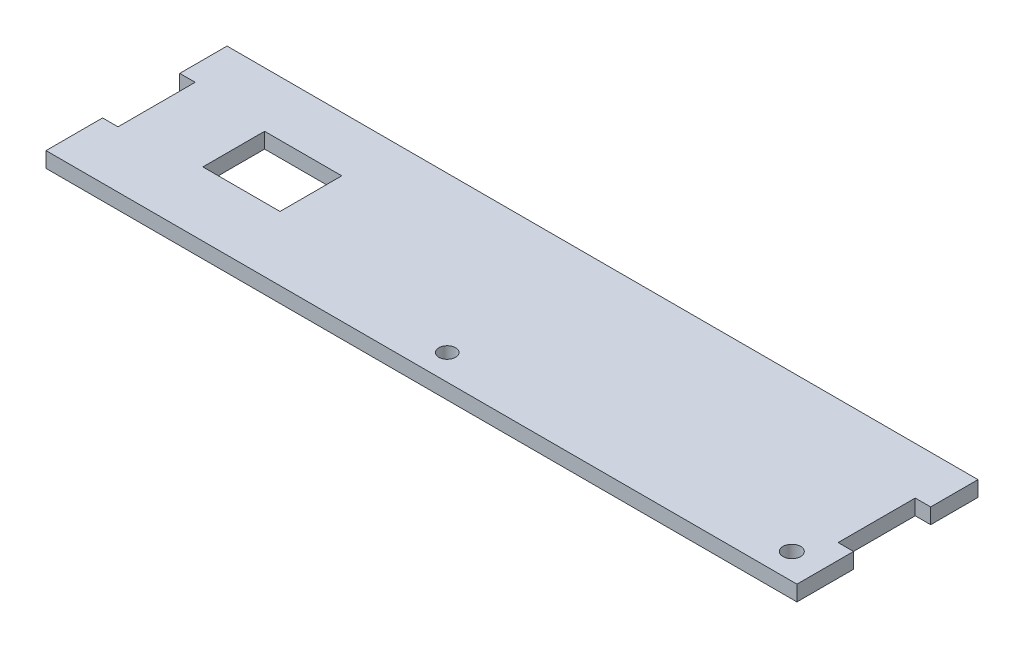
ISO-10303-21;
HEADER;
FILE_DESCRIPTION(('STEP AP214'),'2;1');
FILE_NAME('part.step','',(''),(''),'','','');
FILE_SCHEMA(('AUTOMOTIVE_DESIGN { 1 0 10303 214 1 1 1 1 }'));
ENDSEC;
DATA;
#1=APPLICATION_CONTEXT('core data for automotive mechanical design processes');
#2=APPLICATION_PROTOCOL_DEFINITION('international standard','automotive_design',2000,#1);
#3=PRODUCT_CONTEXT('',#1,'mechanical');
#4=PRODUCT('Part','Part','',(#3));
#5=PRODUCT_RELATED_PRODUCT_CATEGORY('part','',(#4));
#6=PRODUCT_DEFINITION_FORMATION('','',#4);
#7=PRODUCT_DEFINITION_CONTEXT('part definition',#1,'design');
#8=PRODUCT_DEFINITION('design','',#6,#7);
#9=PRODUCT_DEFINITION_SHAPE('','',#8);
#10=(LENGTH_UNIT() NAMED_UNIT(*) SI_UNIT(.MILLI.,.METRE.));
#11=(NAMED_UNIT(*) PLANE_ANGLE_UNIT() SI_UNIT($,.RADIAN.));
#12=(NAMED_UNIT(*) SI_UNIT($,.STERADIAN.) SOLID_ANGLE_UNIT());
#13=UNCERTAINTY_MEASURE_WITH_UNIT(LENGTH_MEASURE(1.E-05),#10,'distance_accuracy_value','');
#14=(GEOMETRIC_REPRESENTATION_CONTEXT(3) GLOBAL_UNCERTAINTY_ASSIGNED_CONTEXT((#13)) GLOBAL_UNIT_ASSIGNED_CONTEXT((#10,
#11,#12)) REPRESENTATION_CONTEXT('',''));
#15=CARTESIAN_POINT('',(0.,0.,0.));
#16=DIRECTION('',(0.,0.,1.));
#17=DIRECTION('',(1.,0.,0.));
#18=AXIS2_PLACEMENT_3D('',#15,#16,#17);
#19=CARTESIAN_POINT('',(-73.,3.,30.5));
#20=DIRECTION('',(1.,0.,0.));
#21=DIRECTION('',(0.,0.,-1.));
#22=AXIS2_PLACEMENT_3D('',#19,#20,#21);
#23=PLANE('',#22);
#24=DIRECTION('',(0.,0.,1.));
#25=VECTOR('',#24,1.);
#26=CARTESIAN_POINT('',(-73.,3.,30.5));
#27=LINE('',#26,#25);
#28=CARTESIAN_POINT('',(-73.,3.,-4.69999999999999));
#29=VERTEX_POINT('',#28);
#30=CARTESIAN_POINT('',(-73.,3.,4.50000000000001));
#31=VERTEX_POINT('',#30);
#32=EDGE_CURVE('E173',#29,#31,#27,.T.);
#33=ORIENTED_EDGE('',*,*,#32,.F.);
#34=DIRECTION('',(0.,1.,0.));
#35=VECTOR('',#34,1.);
#36=CARTESIAN_POINT('',(-73.,-7.,-4.69999999999999));
#37=LINE('',#36,#35);
#38=CARTESIAN_POINT('',(-73.,0.,-4.69999999999999));
#39=VERTEX_POINT('',#38);
#40=EDGE_CURVE('E159',#39,#29,#37,.T.);
#41=ORIENTED_EDGE('',*,*,#40,.F.);
#42=DIRECTION('',(0.,0.,1.));
#43=VECTOR('',#42,1.);
#44=CARTESIAN_POINT('',(-73.,0.,30.5));
#45=LINE('',#44,#43);
#46=CARTESIAN_POINT('',(-73.,0.,4.50000000000001));
#47=VERTEX_POINT('',#46);
#48=EDGE_CURVE('E200',#39,#47,#45,.T.);
#49=ORIENTED_EDGE('',*,*,#48,.T.);
#50=DIRECTION('',(0.,1.,0.));
#51=VECTOR('',#50,1.);
#52=CARTESIAN_POINT('',(-73.,-7.,4.50000000000001));
#53=LINE('',#52,#51);
#54=EDGE_CURVE('E182',#47,#31,#53,.T.);
#55=ORIENTED_EDGE('',*,*,#54,.T.);
#56=EDGE_LOOP('',(#33,#41,#49,#55));
#57=FACE_BOUND('',#56,.T.);
#58=ADVANCED_FACE('F47',(#57),#23,.F.);
#59=CARTESIAN_POINT('',(73.,3.,30.5));
#60=DIRECTION('',(-1.,0.,0.));
#61=DIRECTION('',(0.,0.,1.));
#62=AXIS2_PLACEMENT_3D('',#59,#60,#61);
#63=PLANE('',#62);
#64=DIRECTION('',(0.,0.,-1.));
#65=VECTOR('',#64,1.);
#66=CARTESIAN_POINT('',(73.,0.,30.5));
#67=LINE('',#66,#65);
#68=CARTESIAN_POINT('',(73.,0.,4.49999999999999));
#69=VERTEX_POINT('',#68);
#70=CARTESIAN_POINT('',(73.,0.,-4.69999999999998));
#71=VERTEX_POINT('',#70);
#72=EDGE_CURVE('E207',#69,#71,#67,.T.);
#73=ORIENTED_EDGE('',*,*,#72,.T.);
#74=DIRECTION('',(0.,1.,0.));
#75=VECTOR('',#74,1.);
#76=CARTESIAN_POINT('',(73.,-7.,-4.69999999999999));
#77=LINE('',#76,#75);
#78=CARTESIAN_POINT('',(73.,3.,-4.69999999999999));
#79=VERTEX_POINT('',#78);
#80=EDGE_CURVE('E63',#71,#79,#77,.T.);
#81=ORIENTED_EDGE('',*,*,#80,.T.);
#82=DIRECTION('',(0.,0.,-1.));
#83=VECTOR('',#82,1.);
#84=CARTESIAN_POINT('',(73.,3.,30.5));
#85=LINE('',#84,#83);
#86=CARTESIAN_POINT('',(73.,3.,4.49999999999999));
#87=VERTEX_POINT('',#86);
#88=EDGE_CURVE('E177',#87,#79,#85,.T.);
#89=ORIENTED_EDGE('',*,*,#88,.F.);
#90=DIRECTION('',(0.,1.,0.));
#91=VECTOR('',#90,1.);
#92=CARTESIAN_POINT('',(73.,-7.,4.49999999999999));
#93=LINE('',#92,#91);
#94=EDGE_CURVE('E329',#69,#87,#93,.T.);
#95=ORIENTED_EDGE('',*,*,#94,.F.);
#96=EDGE_LOOP('',(#73,#81,#89,#95));
#97=FACE_BOUND('',#96,.T.);
#98=ADVANCED_FACE('F372',(#97),#63,.F.);
#99=CARTESIAN_POINT('',(-73.,3.,19.5));
#100=VERTEX_POINT('',#99);
#101=CARTESIAN_POINT('',(-73.,3.,30.5));
#102=VERTEX_POINT('',#101);
#103=EDGE_CURVE('E185',#100,#102,#27,.T.);
#104=ORIENTED_EDGE('',*,*,#103,.F.);
#105=DIRECTION('',(0.,1.,0.));
#106=VECTOR('',#105,1.);
#107=CARTESIAN_POINT('',(-73.,-7.,19.5));
#108=LINE('',#107,#106);
#109=CARTESIAN_POINT('',(-73.,0.,19.5));
#110=VERTEX_POINT('',#109);
#111=EDGE_CURVE('E303',#110,#100,#108,.T.);
#112=ORIENTED_EDGE('',*,*,#111,.F.);
#113=CARTESIAN_POINT('',(-73.,0.,30.5));
#114=VERTEX_POINT('',#113);
#115=EDGE_CURVE('E204',#110,#114,#45,.T.);
#116=ORIENTED_EDGE('',*,*,#115,.T.);
#117=DIRECTION('',(0.,-1.,0.));
#118=VECTOR('',#117,1.);
#119=CARTESIAN_POINT('',(-73.,3.,30.5));
#120=LINE('',#119,#118);
#121=EDGE_CURVE('E214',#102,#114,#120,.T.);
#122=ORIENTED_EDGE('',*,*,#121,.F.);
#123=EDGE_LOOP('',(#104,#112,#116,#122));
#124=FACE_BOUND('',#123,.T.);
#125=ADVANCED_FACE('F49',(#124),#23,.F.);
#126=CARTESIAN_POINT('',(73.,3.,30.5));
#127=DIRECTION('',(0.,0.,-1.));
#128=DIRECTION('',(-1.,0.,0.));
#129=AXIS2_PLACEMENT_3D('',#126,#127,#128);
#130=PLANE('',#129);
#131=DIRECTION('',(1.,0.,0.));
#132=VECTOR('',#131,1.);
#133=CARTESIAN_POINT('',(73.,0.,30.5));
#134=LINE('',#133,#132);
#135=CARTESIAN_POINT('',(73.,0.,30.5));
#136=VERTEX_POINT('',#135);
#137=EDGE_CURVE('E203',#114,#136,#134,.T.);
#138=ORIENTED_EDGE('',*,*,#137,.T.);
#139=DIRECTION('',(0.,-1.,0.));
#140=VECTOR('',#139,1.);
#141=CARTESIAN_POINT('',(73.,3.,30.5));
#142=LINE('',#141,#140);
#143=CARTESIAN_POINT('',(73.,3.,30.5));
#144=VERTEX_POINT('',#143);
#145=EDGE_CURVE('E199',#144,#136,#142,.T.);
#146=ORIENTED_EDGE('',*,*,#145,.F.);
#147=DIRECTION('',(1.,0.,0.));
#148=VECTOR('',#147,1.);
#149=CARTESIAN_POINT('',(73.,3.,30.5));
#150=LINE('',#149,#148);
#151=EDGE_CURVE('E184',#102,#144,#150,.T.);
#152=ORIENTED_EDGE('',*,*,#151,.F.);
#153=ORIENTED_EDGE('',*,*,#121,.T.);
#154=EDGE_LOOP('',(#138,#146,#152,#153));
#155=FACE_BOUND('',#154,.T.);
#156=ADVANCED_FACE('F380',(#155),#130,.F.);
#157=CARTESIAN_POINT('',(73.,0.,19.5));
#158=VERTEX_POINT('',#157);
#159=EDGE_CURVE('E190',#136,#158,#67,.T.);
#160=ORIENTED_EDGE('',*,*,#159,.T.);
#161=DIRECTION('',(0.,1.,0.));
#162=VECTOR('',#161,1.);
#163=CARTESIAN_POINT('',(73.,-7.,19.5));
#164=LINE('',#163,#162);
#165=CARTESIAN_POINT('',(73.,3.,19.5));
#166=VERTEX_POINT('',#165);
#167=EDGE_CURVE('E325',#158,#166,#164,.T.);
#168=ORIENTED_EDGE('',*,*,#167,.T.);
#169=EDGE_CURVE('E195',#144,#166,#85,.T.);
#170=ORIENTED_EDGE('',*,*,#169,.F.);
#171=ORIENTED_EDGE('',*,*,#145,.T.);
#172=EDGE_LOOP('',(#160,#168,#170,#171));
#173=FACE_BOUND('',#172,.T.);
#174=ADVANCED_FACE('F351',(#173),#63,.F.);
#175=CARTESIAN_POINT('',(0.,3.,0.));
#176=DIRECTION('',(0.,1.,0.));
#177=DIRECTION('',(0.,0.,1.));
#178=AXIS2_PLACEMENT_3D('',#175,#176,#177);
#179=PLANE('',#178);
#180=DIRECTION('',(1.,0.,0.));
#181=VECTOR('',#180,1.);
#182=CARTESIAN_POINT('',(-73.,3.,-4.69999999999999));
#183=LINE('',#182,#181);
#184=EDGE_CURVE('E162',#29,#79,#183,.T.);
#185=ORIENTED_EDGE('',*,*,#184,.F.);
#186=ORIENTED_EDGE('',*,*,#32,.T.);
#187=DIRECTION('',(-1.,0.,0.));
#188=VECTOR('',#187,1.);
#189=CARTESIAN_POINT('',(-73.,3.,4.50000000000001));
#190=LINE('',#189,#188);
#191=CARTESIAN_POINT('',(-70.,3.,4.50000000000001));
#192=VERTEX_POINT('',#191);
#193=EDGE_CURVE('E278',#192,#31,#190,.T.);
#194=ORIENTED_EDGE('',*,*,#193,.F.);
#195=DIRECTION('',(0.,0.,-1.));
#196=VECTOR('',#195,1.);
#197=CARTESIAN_POINT('',(-70.,3.,4.50000000000001));
#198=LINE('',#197,#196);
#199=CARTESIAN_POINT('',(-70.,3.,19.5));
#200=VERTEX_POINT('',#199);
#201=EDGE_CURVE('E302',#200,#192,#198,.T.);
#202=ORIENTED_EDGE('',*,*,#201,.F.);
#203=DIRECTION('',(1.,0.,0.));
#204=VECTOR('',#203,1.);
#205=CARTESIAN_POINT('',(-70.,3.,19.5));
#206=LINE('',#205,#204);
#207=EDGE_CURVE('E284',#100,#200,#206,.T.);
#208=ORIENTED_EDGE('',*,*,#207,.F.);
#209=ORIENTED_EDGE('',*,*,#103,.T.);
#210=ORIENTED_EDGE('',*,*,#151,.T.);
#211=ORIENTED_EDGE('',*,*,#169,.T.);
#212=DIRECTION('',(1.,0.,0.));
#213=VECTOR('',#212,1.);
#214=CARTESIAN_POINT('',(70.,3.,19.5));
#215=LINE('',#214,#213);
#216=CARTESIAN_POINT('',(70.,3.,19.5));
#217=VERTEX_POINT('',#216);
#218=EDGE_CURVE('E321',#217,#166,#215,.T.);
#219=ORIENTED_EDGE('',*,*,#218,.F.);
#220=DIRECTION('',(0.,0.,1.));
#221=VECTOR('',#220,1.);
#222=CARTESIAN_POINT('',(70.,3.,4.49999999999999));
#223=LINE('',#222,#221);
#224=CARTESIAN_POINT('',(70.,3.,4.49999999999999));
#225=VERTEX_POINT('',#224);
#226=EDGE_CURVE('E334',#225,#217,#223,.T.);
#227=ORIENTED_EDGE('',*,*,#226,.F.);
#228=DIRECTION('',(-1.,0.,0.));
#229=VECTOR('',#228,1.);
#230=CARTESIAN_POINT('',(73.,3.,4.49999999999999));
#231=LINE('',#230,#229);
#232=EDGE_CURVE('E192',#87,#225,#231,.T.);
#233=ORIENTED_EDGE('',*,*,#232,.F.);
#234=ORIENTED_EDGE('',*,*,#88,.T.);
#235=EDGE_LOOP('',(#185,#186,#194,#202,#208,#209,#210,#211,#219,#227,#233,#234));
#236=FACE_BOUND('',#235,.T.);
#237=DIRECTION('',(0.,0.,1.));
#238=VECTOR('',#237,1.);
#239=CARTESIAN_POINT('',(-55.,3.,18.));
#240=LINE('',#239,#238);
#241=CARTESIAN_POINT('',(-55.,3.,6.00000000000001));
#242=VERTEX_POINT('',#241);
#243=CARTESIAN_POINT('',(-55.,3.,18.));
#244=VERTEX_POINT('',#243);
#245=EDGE_CURVE('E70',#242,#244,#240,.T.);
#246=ORIENTED_EDGE('',*,*,#245,.F.);
#247=DIRECTION('',(-1.,0.,0.));
#248=VECTOR('',#247,1.);
#249=CARTESIAN_POINT('',(-40.,3.,6.00000000000001));
#250=LINE('',#249,#248);
#251=CARTESIAN_POINT('',(-40.,3.,6.00000000000001));
#252=VERTEX_POINT('',#251);
#253=EDGE_CURVE('E275',#252,#242,#250,.T.);
#254=ORIENTED_EDGE('',*,*,#253,.F.);
#255=DIRECTION('',(0.,0.,-1.));
#256=VECTOR('',#255,1.);
#257=CARTESIAN_POINT('',(-40.,3.,18.));
#258=LINE('',#257,#256);
#259=CARTESIAN_POINT('',(-40.,3.,18.));
#260=VERTEX_POINT('',#259);
#261=EDGE_CURVE('E290',#260,#252,#258,.T.);
#262=ORIENTED_EDGE('',*,*,#261,.F.);
#263=DIRECTION('',(1.,0.,0.));
#264=VECTOR('',#263,1.);
#265=CARTESIAN_POINT('',(-40.,3.,18.));
#266=LINE('',#265,#264);
#267=EDGE_CURVE('E294',#244,#260,#266,.T.);
#268=ORIENTED_EDGE('',*,*,#267,.F.);
#269=EDGE_LOOP('',(#246,#254,#262,#268));
#270=FACE_BOUND('',#269,.T.);
#271=CARTESIAN_POINT('',(0.,3.,25.5));
#272=DIRECTION('',(0.,1.,0.));
#273=DIRECTION('',(0.,0.,1.));
#274=AXIS2_PLACEMENT_3D('',#271,#272,#273);
#275=CIRCLE('',#274,1.62135742405327);
#276=CARTESIAN_POINT('',(0.,3.,27.1213574240533));
#277=VERTEX_POINT('',#276);
#278=EDGE_CURVE('E332',#277,#277,#275,.T.);
#279=ORIENTED_EDGE('',*,*,#278,.F.);
#280=EDGE_LOOP('',(#279));
#281=FACE_BOUND('',#280,.T.);
#282=CARTESIAN_POINT('',(67.,3.,25.5));
#283=DIRECTION('',(0.,1.,0.));
#284=DIRECTION('',(0.,0.,1.));
#285=AXIS2_PLACEMENT_3D('',#282,#283,#284);
#286=CIRCLE('',#285,1.71863543222905);
#287=CARTESIAN_POINT('',(67.,3.,27.2186354322291));
#288=VERTEX_POINT('',#287);
#289=EDGE_CURVE('E403',#288,#288,#286,.T.);
#290=ORIENTED_EDGE('',*,*,#289,.F.);
#291=EDGE_LOOP('',(#290));
#292=FACE_BOUND('',#291,.T.);
#293=ADVANCED_FACE('F170',(#236,#270,#281,#292),#179,.T.);
#294=CARTESIAN_POINT('',(0.,0.,0.));
#295=DIRECTION('',(0.,1.,0.));
#296=DIRECTION('',(0.,0.,1.));
#297=AXIS2_PLACEMENT_3D('',#294,#295,#296);
#298=PLANE('',#297);
#299=DIRECTION('',(-1.,0.,0.));
#300=VECTOR('',#299,1.);
#301=CARTESIAN_POINT('',(0.,0.,6.00000000000001));
#302=LINE('',#301,#300);
#303=CARTESIAN_POINT('',(-40.,0.,6.00000000000001));
#304=VERTEX_POINT('',#303);
#305=CARTESIAN_POINT('',(-55.,0.,6.00000000000001));
#306=VERTEX_POINT('',#305);
#307=EDGE_CURVE('E258',#304,#306,#302,.T.);
#308=ORIENTED_EDGE('',*,*,#307,.T.);
#309=DIRECTION('',(0.,0.,1.));
#310=VECTOR('',#309,1.);
#311=CARTESIAN_POINT('',(-55.,0.,0.));
#312=LINE('',#311,#310);
#313=CARTESIAN_POINT('',(-55.,0.,18.));
#314=VERTEX_POINT('',#313);
#315=EDGE_CURVE('E56',#306,#314,#312,.T.);
#316=ORIENTED_EDGE('',*,*,#315,.T.);
#317=DIRECTION('',(1.,0.,0.));
#318=VECTOR('',#317,1.);
#319=CARTESIAN_POINT('',(0.,0.,18.));
#320=LINE('',#319,#318);
#321=CARTESIAN_POINT('',(-40.,0.,18.));
#322=VERTEX_POINT('',#321);
#323=EDGE_CURVE('E250',#314,#322,#320,.T.);
#324=ORIENTED_EDGE('',*,*,#323,.T.);
#325=DIRECTION('',(0.,0.,-1.));
#326=VECTOR('',#325,1.);
#327=CARTESIAN_POINT('',(-40.,0.,0.));
#328=LINE('',#327,#326);
#329=EDGE_CURVE('E254',#322,#304,#328,.T.);
#330=ORIENTED_EDGE('',*,*,#329,.T.);
#331=EDGE_LOOP('',(#308,#316,#324,#330));
#332=FACE_BOUND('',#331,.T.);
#333=ORIENTED_EDGE('',*,*,#48,.F.);
#334=DIRECTION('',(1.,0.,0.));
#335=VECTOR('',#334,1.);
#336=CARTESIAN_POINT('',(0.,0.,-4.69999999999999));
#337=LINE('',#336,#335);
#338=EDGE_CURVE('E11',#39,#71,#337,.T.);
#339=ORIENTED_EDGE('',*,*,#338,.T.);
#340=ORIENTED_EDGE('',*,*,#72,.F.);
#341=DIRECTION('',(-1.,0.,0.));
#342=VECTOR('',#341,1.);
#343=CARTESIAN_POINT('',(0.,0.,4.49999999999999));
#344=LINE('',#343,#342);
#345=CARTESIAN_POINT('',(70.,0.,4.49999999999999));
#346=VERTEX_POINT('',#345);
#347=EDGE_CURVE('E234',#69,#346,#344,.T.);
#348=ORIENTED_EDGE('',*,*,#347,.T.);
#349=DIRECTION('',(0.,0.,1.));
#350=VECTOR('',#349,1.);
#351=CARTESIAN_POINT('',(70.,0.,0.));
#352=LINE('',#351,#350);
#353=CARTESIAN_POINT('',(70.,0.,19.5));
#354=VERTEX_POINT('',#353);
#355=EDGE_CURVE('E218',#346,#354,#352,.T.);
#356=ORIENTED_EDGE('',*,*,#355,.T.);
#357=DIRECTION('',(1.,0.,0.));
#358=VECTOR('',#357,1.);
#359=CARTESIAN_POINT('',(0.,0.,19.5));
#360=LINE('',#359,#358);
#361=EDGE_CURVE('E230',#354,#158,#360,.T.);
#362=ORIENTED_EDGE('',*,*,#361,.T.);
#363=ORIENTED_EDGE('',*,*,#159,.F.);
#364=ORIENTED_EDGE('',*,*,#137,.F.);
#365=ORIENTED_EDGE('',*,*,#115,.F.);
#366=DIRECTION('',(1.,0.,0.));
#367=VECTOR('',#366,1.);
#368=CARTESIAN_POINT('',(0.,0.,19.5));
#369=LINE('',#368,#367);
#370=CARTESIAN_POINT('',(-70.,0.,19.5));
#371=VERTEX_POINT('',#370);
#372=EDGE_CURVE('E238',#110,#371,#369,.T.);
#373=ORIENTED_EDGE('',*,*,#372,.T.);
#374=DIRECTION('',(0.,0.,-1.));
#375=VECTOR('',#374,1.);
#376=CARTESIAN_POINT('',(-70.,0.,0.));
#377=LINE('',#376,#375);
#378=CARTESIAN_POINT('',(-70.,0.,4.50000000000001));
#379=VERTEX_POINT('',#378);
#380=EDGE_CURVE('E242',#371,#379,#377,.T.);
#381=ORIENTED_EDGE('',*,*,#380,.T.);
#382=DIRECTION('',(-1.,0.,0.));
#383=VECTOR('',#382,1.);
#384=CARTESIAN_POINT('',(0.,0.,4.50000000000003));
#385=LINE('',#384,#383);
#386=EDGE_CURVE('E246',#379,#47,#385,.T.);
#387=ORIENTED_EDGE('',*,*,#386,.T.);
#388=EDGE_LOOP('',(#333,#339,#340,#348,#356,#362,#363,#364,#365,#373,#381,#387));
#389=FACE_BOUND('',#388,.T.);
#390=CARTESIAN_POINT('',(0.,0.,25.5));
#391=DIRECTION('',(0.,1.,0.));
#392=DIRECTION('',(0.,0.,1.));
#393=AXIS2_PLACEMENT_3D('',#390,#391,#392);
#394=CIRCLE('',#393,1.62135742405327);
#395=CARTESIAN_POINT('',(0.,0.,27.1213574240533));
#396=VERTEX_POINT('',#395);
#397=EDGE_CURVE('E223',#396,#396,#394,.T.);
#398=ORIENTED_EDGE('',*,*,#397,.T.);
#399=EDGE_LOOP('',(#398));
#400=FACE_BOUND('',#399,.T.);
#401=CARTESIAN_POINT('',(67.,0.,25.5));
#402=DIRECTION('',(0.,1.,0.));
#403=DIRECTION('',(0.,0.,1.));
#404=AXIS2_PLACEMENT_3D('',#401,#402,#403);
#405=CIRCLE('',#404,1.71863543222905);
#406=CARTESIAN_POINT('',(67.,0.,27.2186354322291));
#407=VERTEX_POINT('',#406);
#408=EDGE_CURVE('E219',#407,#407,#405,.T.);
#409=ORIENTED_EDGE('',*,*,#408,.T.);
#410=EDGE_LOOP('',(#409));
#411=FACE_BOUND('',#410,.T.);
#412=ADVANCED_FACE('F264',(#332,#389,#400,#411),#298,.F.);
#413=CARTESIAN_POINT('',(67.,-7.,25.5));
#414=DIRECTION('',(0.,1.,0.));
#415=DIRECTION('',(0.,0.,1.));
#416=AXIS2_PLACEMENT_3D('',#413,#414,#415);
#417=CYLINDRICAL_SURFACE('',#416,1.71863543222905);
#418=ORIENTED_EDGE('',*,*,#289,.T.);
#419=EDGE_LOOP('',(#418));
#420=FACE_BOUND('',#419,.T.);
#421=ORIENTED_EDGE('',*,*,#408,.F.);
#422=EDGE_LOOP('',(#421));
#423=FACE_BOUND('',#422,.T.);
#424=ADVANCED_FACE('F426',(#420,#423),#417,.F.);
#425=CARTESIAN_POINT('',(0.,-7.,25.5));
#426=DIRECTION('',(0.,1.,0.));
#427=DIRECTION('',(0.,0.,1.));
#428=AXIS2_PLACEMENT_3D('',#425,#426,#427);
#429=CYLINDRICAL_SURFACE('',#428,1.62135742405327);
#430=ORIENTED_EDGE('',*,*,#278,.T.);
#431=EDGE_LOOP('',(#430));
#432=FACE_BOUND('',#431,.T.);
#433=ORIENTED_EDGE('',*,*,#397,.F.);
#434=EDGE_LOOP('',(#433));
#435=FACE_BOUND('',#434,.T.);
#436=ADVANCED_FACE('F422',(#432,#435),#429,.F.);
#437=CARTESIAN_POINT('',(73.,-7.,4.49999999999999));
#438=DIRECTION('',(0.,0.,-1.));
#439=DIRECTION('',(-1.,0.,0.));
#440=AXIS2_PLACEMENT_3D('',#437,#438,#439);
#441=PLANE('',#440);
#442=ORIENTED_EDGE('',*,*,#94,.T.);
#443=ORIENTED_EDGE('',*,*,#232,.T.);
#444=DIRECTION('',(0.,1.,0.));
#445=VECTOR('',#444,1.);
#446=CARTESIAN_POINT('',(70.,-7.,4.49999999999999));
#447=LINE('',#446,#445);
#448=EDGE_CURVE('E318',#346,#225,#447,.T.);
#449=ORIENTED_EDGE('',*,*,#448,.F.);
#450=ORIENTED_EDGE('',*,*,#347,.F.);
#451=EDGE_LOOP('',(#442,#443,#449,#450));
#452=FACE_BOUND('',#451,.T.);
#453=ADVANCED_FACE('F344',(#452),#441,.F.);
#454=CARTESIAN_POINT('',(70.,-7.,19.5));
#455=DIRECTION('',(0.,0.,1.));
#456=DIRECTION('',(1.,0.,0.));
#457=AXIS2_PLACEMENT_3D('',#454,#455,#456);
#458=PLANE('',#457);
#459=DIRECTION('',(0.,1.,0.));
#460=VECTOR('',#459,1.);
#461=CARTESIAN_POINT('',(70.,-7.,19.5));
#462=LINE('',#461,#460);
#463=EDGE_CURVE('E322',#354,#217,#462,.T.);
#464=ORIENTED_EDGE('',*,*,#463,.T.);
#465=ORIENTED_EDGE('',*,*,#218,.T.);
#466=ORIENTED_EDGE('',*,*,#167,.F.);
#467=ORIENTED_EDGE('',*,*,#361,.F.);
#468=EDGE_LOOP('',(#464,#465,#466,#467));
#469=FACE_BOUND('',#468,.T.);
#470=ADVANCED_FACE('F348',(#469),#458,.F.);
#471=CARTESIAN_POINT('',(70.,-7.,4.49999999999999));
#472=DIRECTION('',(-1.,0.,0.));
#473=DIRECTION('',(0.,0.,1.));
#474=AXIS2_PLACEMENT_3D('',#471,#472,#473);
#475=PLANE('',#474);
#476=ORIENTED_EDGE('',*,*,#448,.T.);
#477=ORIENTED_EDGE('',*,*,#226,.T.);
#478=ORIENTED_EDGE('',*,*,#463,.F.);
#479=ORIENTED_EDGE('',*,*,#355,.F.);
#480=EDGE_LOOP('',(#476,#477,#478,#479));
#481=FACE_BOUND('',#480,.T.);
#482=ADVANCED_FACE('F358',(#481),#475,.F.);
#483=CARTESIAN_POINT('',(-73.,-7.,4.50000000000001));
#484=DIRECTION('',(0.,0.,-1.));
#485=DIRECTION('',(-1.,0.,0.));
#486=AXIS2_PLACEMENT_3D('',#483,#484,#485);
#487=PLANE('',#486);
#488=DIRECTION('',(0.,1.,0.));
#489=VECTOR('',#488,1.);
#490=CARTESIAN_POINT('',(-70.,-7.,4.50000000000001));
#491=LINE('',#490,#489);
#492=EDGE_CURVE('E309',#379,#192,#491,.T.);
#493=ORIENTED_EDGE('',*,*,#492,.T.);
#494=ORIENTED_EDGE('',*,*,#193,.T.);
#495=ORIENTED_EDGE('',*,*,#54,.F.);
#496=ORIENTED_EDGE('',*,*,#386,.F.);
#497=EDGE_LOOP('',(#493,#494,#495,#496));
#498=FACE_BOUND('',#497,.T.);
#499=ADVANCED_FACE('F360',(#498),#487,.F.);
#500=CARTESIAN_POINT('',(-70.,-7.,4.50000000000001));
#501=DIRECTION('',(1.,0.,0.));
#502=DIRECTION('',(0.,0.,-1.));
#503=AXIS2_PLACEMENT_3D('',#500,#501,#502);
#504=PLANE('',#503);
#505=DIRECTION('',(0.,1.,0.));
#506=VECTOR('',#505,1.);
#507=CARTESIAN_POINT('',(-70.,-7.,19.5));
#508=LINE('',#507,#506);
#509=EDGE_CURVE('E306',#371,#200,#508,.T.);
#510=ORIENTED_EDGE('',*,*,#509,.T.);
#511=ORIENTED_EDGE('',*,*,#201,.T.);
#512=ORIENTED_EDGE('',*,*,#492,.F.);
#513=ORIENTED_EDGE('',*,*,#380,.F.);
#514=EDGE_LOOP('',(#510,#511,#512,#513));
#515=FACE_BOUND('',#514,.T.);
#516=ADVANCED_FACE('F366',(#515),#504,.F.);
#517=CARTESIAN_POINT('',(-70.,-7.,19.5));
#518=DIRECTION('',(0.,0.,1.));
#519=DIRECTION('',(1.,0.,0.));
#520=AXIS2_PLACEMENT_3D('',#517,#518,#519);
#521=PLANE('',#520);
#522=ORIENTED_EDGE('',*,*,#111,.T.);
#523=ORIENTED_EDGE('',*,*,#207,.T.);
#524=ORIENTED_EDGE('',*,*,#509,.F.);
#525=ORIENTED_EDGE('',*,*,#372,.F.);
#526=EDGE_LOOP('',(#522,#523,#524,#525));
#527=FACE_BOUND('',#526,.T.);
#528=ADVANCED_FACE('F394',(#527),#521,.F.);
#529=CARTESIAN_POINT('',(-55.,-7.,18.));
#530=DIRECTION('',(-1.,0.,0.));
#531=DIRECTION('',(0.,0.,1.));
#532=AXIS2_PLACEMENT_3D('',#529,#530,#531);
#533=PLANE('',#532);
#534=DIRECTION('',(0.,1.,0.));
#535=VECTOR('',#534,1.);
#536=CARTESIAN_POINT('',(-55.,-7.,6.00000000000001));
#537=LINE('',#536,#535);
#538=EDGE_CURVE('E268',#306,#242,#537,.T.);
#539=ORIENTED_EDGE('',*,*,#538,.T.);
#540=ORIENTED_EDGE('',*,*,#245,.T.);
#541=DIRECTION('',(0.,1.,0.));
#542=VECTOR('',#541,1.);
#543=CARTESIAN_POINT('',(-55.,-7.,18.));
#544=LINE('',#543,#542);
#545=EDGE_CURVE('E270',#314,#244,#544,.T.);
#546=ORIENTED_EDGE('',*,*,#545,.F.);
#547=ORIENTED_EDGE('',*,*,#315,.F.);
#548=EDGE_LOOP('',(#539,#540,#546,#547));
#549=FACE_BOUND('',#548,.T.);
#550=ADVANCED_FACE('F267',(#549),#533,.F.);
#551=CARTESIAN_POINT('',(-40.,-7.,6.00000000000001));
#552=DIRECTION('',(0.,0.,-1.));
#553=DIRECTION('',(-1.,0.,0.));
#554=AXIS2_PLACEMENT_3D('',#551,#552,#553);
#555=PLANE('',#554);
#556=DIRECTION('',(0.,1.,0.));
#557=VECTOR('',#556,1.);
#558=CARTESIAN_POINT('',(-40.,-7.,6.00000000000001));
#559=LINE('',#558,#557);
#560=EDGE_CURVE('E277',#304,#252,#559,.T.);
#561=ORIENTED_EDGE('',*,*,#560,.T.);
#562=ORIENTED_EDGE('',*,*,#253,.T.);
#563=ORIENTED_EDGE('',*,*,#538,.F.);
#564=ORIENTED_EDGE('',*,*,#307,.F.);
#565=EDGE_LOOP('',(#561,#562,#563,#564));
#566=FACE_BOUND('',#565,.T.);
#567=ADVANCED_FACE('F272',(#566),#555,.F.);
#568=CARTESIAN_POINT('',(-40.,-7.,18.));
#569=DIRECTION('',(1.,0.,0.));
#570=DIRECTION('',(0.,0.,-1.));
#571=AXIS2_PLACEMENT_3D('',#568,#569,#570);
#572=PLANE('',#571);
#573=DIRECTION('',(0.,1.,0.));
#574=VECTOR('',#573,1.);
#575=CARTESIAN_POINT('',(-40.,-7.,18.));
#576=LINE('',#575,#574);
#577=EDGE_CURVE('E282',#322,#260,#576,.T.);
#578=ORIENTED_EDGE('',*,*,#577,.T.);
#579=ORIENTED_EDGE('',*,*,#261,.T.);
#580=ORIENTED_EDGE('',*,*,#560,.F.);
#581=ORIENTED_EDGE('',*,*,#329,.F.);
#582=EDGE_LOOP('',(#578,#579,#580,#581));
#583=FACE_BOUND('',#582,.T.);
#584=ADVANCED_FACE('F441',(#583),#572,.F.);
#585=CARTESIAN_POINT('',(-40.,-7.,18.));
#586=DIRECTION('',(0.,0.,1.));
#587=DIRECTION('',(1.,0.,0.));
#588=AXIS2_PLACEMENT_3D('',#585,#586,#587);
#589=PLANE('',#588);
#590=ORIENTED_EDGE('',*,*,#545,.T.);
#591=ORIENTED_EDGE('',*,*,#267,.T.);
#592=ORIENTED_EDGE('',*,*,#577,.F.);
#593=ORIENTED_EDGE('',*,*,#323,.F.);
#594=EDGE_LOOP('',(#590,#591,#592,#593));
#595=FACE_BOUND('',#594,.T.);
#596=ADVANCED_FACE('F439',(#595),#589,.F.);
#597=CARTESIAN_POINT('',(-73.,-7.,-4.69999999999999));
#598=DIRECTION('',(0.,0.,1.));
#599=DIRECTION('',(1.,0.,0.));
#600=AXIS2_PLACEMENT_3D('',#597,#598,#599);
#601=PLANE('',#600);
#602=ORIENTED_EDGE('',*,*,#40,.T.);
#603=ORIENTED_EDGE('',*,*,#184,.T.);
#604=ORIENTED_EDGE('',*,*,#80,.F.);
#605=ORIENTED_EDGE('',*,*,#338,.F.);
#606=EDGE_LOOP('',(#602,#603,#604,#605));
#607=FACE_BOUND('',#606,.T.);
#608=ADVANCED_FACE('F161',(#607),#601,.F.);
#609=CLOSED_SHELL('',(#58,#98,#125,#156,#174,#293,#412,#424,#436,#453,#470,#482,#499,#516,#528,
#550,#567,#584,#596,#608));
#610=MANIFOLD_SOLID_BREP('B2',#609);
#611=ADVANCED_BREP_SHAPE_REPRESENTATION('',(#18,#610),#14);
#612=SHAPE_DEFINITION_REPRESENTATION(#9,#611);
ENDSEC;
END-ISO-10303-21;
